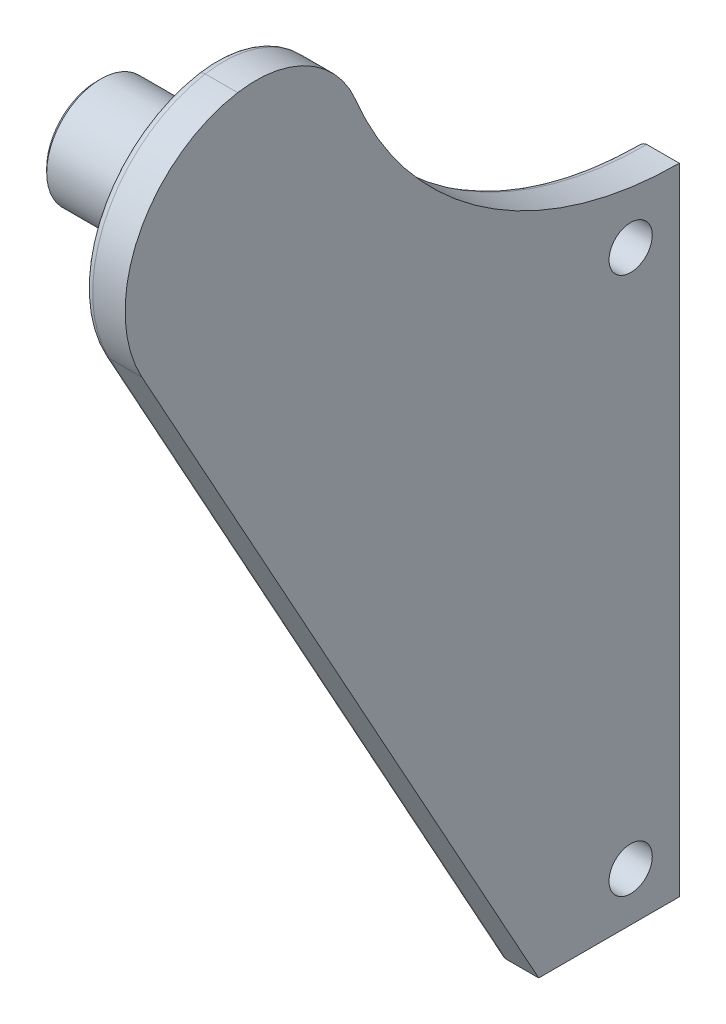
ISO-10303-21;
HEADER;
FILE_DESCRIPTION(('STEP AP214'),'2;1');
FILE_NAME('part.step','',(''),(''),'','','');
FILE_SCHEMA(('AUTOMOTIVE_DESIGN { 1 0 10303 214 1 1 1 1 }'));
ENDSEC;
DATA;
#1=APPLICATION_CONTEXT('core data for automotive mechanical design processes');
#2=APPLICATION_PROTOCOL_DEFINITION('international standard','automotive_design',2000,#1);
#3=PRODUCT_CONTEXT('',#1,'mechanical');
#4=PRODUCT('Part','Part','',(#3));
#5=PRODUCT_RELATED_PRODUCT_CATEGORY('part','',(#4));
#6=PRODUCT_DEFINITION_FORMATION('','',#4);
#7=PRODUCT_DEFINITION_CONTEXT('part definition',#1,'design');
#8=PRODUCT_DEFINITION('design','',#6,#7);
#9=PRODUCT_DEFINITION_SHAPE('','',#8);
#10=(LENGTH_UNIT() NAMED_UNIT(*) SI_UNIT(.MILLI.,.METRE.));
#11=(NAMED_UNIT(*) PLANE_ANGLE_UNIT() SI_UNIT($,.RADIAN.));
#12=(NAMED_UNIT(*) SI_UNIT($,.STERADIAN.) SOLID_ANGLE_UNIT());
#13=UNCERTAINTY_MEASURE_WITH_UNIT(LENGTH_MEASURE(1.E-05),#10,'distance_accuracy_value','');
#14=(GEOMETRIC_REPRESENTATION_CONTEXT(3) GLOBAL_UNCERTAINTY_ASSIGNED_CONTEXT((#13)) GLOBAL_UNIT_ASSIGNED_CONTEXT((#10,
#11,#12)) REPRESENTATION_CONTEXT('',''));
#15=CARTESIAN_POINT('',(0.,0.,0.));
#16=DIRECTION('',(0.,0.,1.));
#17=DIRECTION('',(1.,0.,0.));
#18=AXIS2_PLACEMENT_3D('',#15,#16,#17);
#19=CARTESIAN_POINT('',(3.,0.,0.));
#20=DIRECTION('',(-1.,0.,0.));
#21=DIRECTION('',(0.,0.,1.));
#22=AXIS2_PLACEMENT_3D('',#19,#20,#21);
#23=CYLINDRICAL_SURFACE('',#22,10.);
#24=DIRECTION('',(-1.,0.,0.));
#25=VECTOR('',#24,1.);
#26=CARTESIAN_POINT('',(3.,9.85928106785286,1.67169878419478));
#27=LINE('',#26,#25);
#28=CARTESIAN_POINT('',(3.,9.85928106785286,1.67169878419478));
#29=VERTEX_POINT('',#28);
#30=CARTESIAN_POINT('',(0.6,9.85928106785286,1.67169878419478));
#31=VERTEX_POINT('',#30);
#32=EDGE_CURVE('E181',#29,#31,#27,.T.);
#33=ORIENTED_EDGE('',*,*,#32,.T.);
#34=CARTESIAN_POINT('',(0.6,0.,0.));
#35=DIRECTION('',(1.,0.,0.));
#36=DIRECTION('',(0.,0.,-1.));
#37=AXIS2_PLACEMENT_3D('',#34,#35,#36);
#38=CIRCLE('',#37,10.);
#39=CARTESIAN_POINT('',(0.6,-4.83342796430402,8.75431174415693));
#40=VERTEX_POINT('',#39);
#41=EDGE_CURVE('E205',#31,#40,#38,.T.);
#42=ORIENTED_EDGE('',*,*,#41,.T.);
#43=DIRECTION('',(-1.,0.,0.));
#44=VECTOR('',#43,1.);
#45=CARTESIAN_POINT('',(3.,-4.83342796430402,8.75431174415693));
#46=LINE('',#45,#44);
#47=CARTESIAN_POINT('',(3.,-4.83342796430402,8.75431174415693));
#48=VERTEX_POINT('',#47);
#49=EDGE_CURVE('E158',#48,#40,#46,.T.);
#50=ORIENTED_EDGE('',*,*,#49,.F.);
#51=CARTESIAN_POINT('',(3.,0.,0.));
#52=DIRECTION('',(1.,0.,0.));
#53=DIRECTION('',(0.,0.,-1.));
#54=AXIS2_PLACEMENT_3D('',#51,#52,#53);
#55=CIRCLE('',#54,10.);
#56=EDGE_CURVE('E175',#29,#48,#55,.T.);
#57=ORIENTED_EDGE('',*,*,#56,.F.);
#58=EDGE_LOOP('',(#33,#42,#50,#57));
#59=FACE_BOUND('',#58,.T.);
#60=ADVANCED_FACE('F45',(#59),#23,.T.);
#61=CARTESIAN_POINT('',(3.,-58.,-20.6));
#62=DIRECTION('',(0.,0.483342796430402,-0.875431174415693));
#63=DIRECTION('',(0.,0.875431174415693,0.483342796430402));
#64=AXIS2_PLACEMENT_3D('',#61,#62,#63);
#65=PLANE('',#64);
#66=ORIENTED_EDGE('',*,*,#49,.T.);
#67=DIRECTION('',(0.,-0.875431174415693,-0.483342796430402));
#68=VECTOR('',#67,1.);
#69=CARTESIAN_POINT('',(0.6,-58.,-20.6));
#70=LINE('',#69,#68);
#71=CARTESIAN_POINT('',(0.6,-58.,-20.6));
#72=VERTEX_POINT('',#71);
#73=EDGE_CURVE('E187',#40,#72,#70,.T.);
#74=ORIENTED_EDGE('',*,*,#73,.T.);
#75=DIRECTION('',(-1.,0.,0.));
#76=VECTOR('',#75,1.);
#77=CARTESIAN_POINT('',(3.,-58.,-20.6));
#78=LINE('',#77,#76);
#79=CARTESIAN_POINT('',(3.,-58.,-20.6));
#80=VERTEX_POINT('',#79);
#81=EDGE_CURVE('E152',#80,#72,#78,.T.);
#82=ORIENTED_EDGE('',*,*,#81,.F.);
#83=DIRECTION('',(0.,-0.875431174415693,-0.483342796430402));
#84=VECTOR('',#83,1.);
#85=CARTESIAN_POINT('',(3.,-58.,-20.6));
#86=LINE('',#85,#84);
#87=EDGE_CURVE('E357',#48,#80,#86,.T.);
#88=ORIENTED_EDGE('',*,*,#87,.F.);
#89=EDGE_LOOP('',(#66,#74,#82,#88));
#90=FACE_BOUND('',#89,.T.);
#91=ADVANCED_FACE('F303',(#90),#65,.F.);
#92=CARTESIAN_POINT('',(3.,-58.,-31.));
#93=DIRECTION('',(0.,1.,0.));
#94=DIRECTION('',(0.,0.,1.));
#95=AXIS2_PLACEMENT_3D('',#92,#93,#94);
#96=PLANE('',#95);
#97=ORIENTED_EDGE('',*,*,#81,.T.);
#98=DIRECTION('',(0.,0.,-1.));
#99=VECTOR('',#98,1.);
#100=CARTESIAN_POINT('',(0.6,-58.,-31.));
#101=LINE('',#100,#99);
#102=CARTESIAN_POINT('',(0.6,-58.,-31.));
#103=VERTEX_POINT('',#102);
#104=EDGE_CURVE('E209',#72,#103,#101,.T.);
#105=ORIENTED_EDGE('',*,*,#104,.T.);
#106=DIRECTION('',(-1.,0.,0.));
#107=VECTOR('',#106,1.);
#108=CARTESIAN_POINT('',(3.,-58.,-31.));
#109=LINE('',#108,#107);
#110=CARTESIAN_POINT('',(3.,-58.,-31.));
#111=VERTEX_POINT('',#110);
#112=EDGE_CURVE('E150',#111,#103,#109,.T.);
#113=ORIENTED_EDGE('',*,*,#112,.F.);
#114=DIRECTION('',(0.,0.,-1.));
#115=VECTOR('',#114,1.);
#116=CARTESIAN_POINT('',(3.,-58.,-31.));
#117=LINE('',#116,#115);
#118=EDGE_CURVE('E142',#80,#111,#117,.T.);
#119=ORIENTED_EDGE('',*,*,#118,.F.);
#120=EDGE_LOOP('',(#97,#105,#113,#119));
#121=FACE_BOUND('',#120,.T.);
#122=ADVANCED_FACE('F310',(#121),#96,.F.);
#123=CARTESIAN_POINT('',(3.,-11.,-31.));
#124=DIRECTION('',(0.,0.,1.));
#125=DIRECTION('',(0.,-1.,0.));
#126=AXIS2_PLACEMENT_3D('',#123,#124,#125);
#127=PLANE('',#126);
#128=ORIENTED_EDGE('',*,*,#112,.T.);
#129=DIRECTION('',(0.,1.,0.));
#130=VECTOR('',#129,1.);
#131=CARTESIAN_POINT('',(0.6,-11.,-31.));
#132=LINE('',#131,#130);
#133=CARTESIAN_POINT('',(0.6,-11.,-31.));
#134=VERTEX_POINT('',#133);
#135=EDGE_CURVE('E149',#103,#134,#132,.T.);
#136=ORIENTED_EDGE('',*,*,#135,.T.);
#137=DIRECTION('',(-1.,0.,0.));
#138=VECTOR('',#137,1.);
#139=CARTESIAN_POINT('',(3.,-11.,-31.));
#140=LINE('',#139,#138);
#141=CARTESIAN_POINT('',(3.,-11.,-31.));
#142=VERTEX_POINT('',#141);
#143=EDGE_CURVE('E129',#142,#134,#140,.T.);
#144=ORIENTED_EDGE('',*,*,#143,.F.);
#145=DIRECTION('',(0.,1.,0.));
#146=VECTOR('',#145,1.);
#147=CARTESIAN_POINT('',(3.,-11.,-31.));
#148=LINE('',#147,#146);
#149=EDGE_CURVE('E138',#111,#142,#148,.T.);
#150=ORIENTED_EDGE('',*,*,#149,.F.);
#151=EDGE_LOOP('',(#128,#136,#144,#150));
#152=FACE_BOUND('',#151,.T.);
#153=ADVANCED_FACE('F147',(#152),#127,.F.);
#154=CARTESIAN_POINT('',(3.,0.,0.));
#155=DIRECTION('',(1.,0.,0.));
#156=DIRECTION('',(0.,0.,-1.));
#157=AXIS2_PLACEMENT_3D('',#154,#155,#156);
#158=PLANE('',#157);
#159=CARTESIAN_POINT('',(3.,14.8944628115408,-31.));
#160=DIRECTION('',(1.,0.,0.));
#161=DIRECTION('',(0.,0.,-1.));
#162=AXIS2_PLACEMENT_3D('',#159,#160,#161);
#163=CIRCLE('',#162,25.8944628115408);
#164=CARTESIAN_POINT('',(3.,5.02193708839009,-7.06140271143698));
#165=VERTEX_POINT('',#164);
#166=EDGE_CURVE('E125',#165,#142,#163,.T.);
#167=ORIENTED_EDGE('',*,*,#166,.F.);
#168=CARTESIAN_POINT('',(3.,1.97185621357057,0.334339756838956));
#169=DIRECTION('',(1.,0.,0.));
#170=DIRECTION('',(0.,0.,-1.));
#171=AXIS2_PLACEMENT_3D('',#168,#169,#170);
#172=CIRCLE('',#171,8.);
#173=EDGE_CURVE('E185',#165,#29,#172,.T.);
#174=ORIENTED_EDGE('',*,*,#173,.T.);
#175=ORIENTED_EDGE('',*,*,#56,.T.);
#176=ORIENTED_EDGE('',*,*,#87,.T.);
#177=ORIENTED_EDGE('',*,*,#118,.T.);
#178=ORIENTED_EDGE('',*,*,#149,.T.);
#179=EDGE_LOOP('',(#167,#174,#175,#176,#177,#178));
#180=FACE_BOUND('',#179,.T.);
#181=CARTESIAN_POINT('',(3.,-54.4,-27.4));
#182=DIRECTION('',(1.,0.,0.));
#183=DIRECTION('',(0.,0.,-1.));
#184=AXIS2_PLACEMENT_3D('',#181,#182,#183);
#185=CIRCLE('',#184,1.6);
#186=CARTESIAN_POINT('',(3.,-54.4,-29.));
#187=VERTEX_POINT('',#186);
#188=EDGE_CURVE('E172',#187,#187,#185,.T.);
#189=ORIENTED_EDGE('',*,*,#188,.F.);
#190=EDGE_LOOP('',(#189));
#191=FACE_BOUND('',#190,.T.);
#192=CARTESIAN_POINT('',(3.,-14.6,-27.4));
#193=DIRECTION('',(1.,0.,0.));
#194=DIRECTION('',(0.,0.,-1.));
#195=AXIS2_PLACEMENT_3D('',#192,#193,#194);
#196=CIRCLE('',#195,1.6);
#197=CARTESIAN_POINT('',(3.,-14.6,-29.));
#198=VERTEX_POINT('',#197);
#199=EDGE_CURVE('E178',#198,#198,#196,.T.);
#200=ORIENTED_EDGE('',*,*,#199,.F.);
#201=EDGE_LOOP('',(#200));
#202=FACE_BOUND('',#201,.T.);
#203=ADVANCED_FACE('F139',(#180,#191,#202),#158,.T.);
#204=CARTESIAN_POINT('',(0.,0.,0.));
#205=DIRECTION('',(1.,0.,0.));
#206=DIRECTION('',(0.,0.,-1.));
#207=AXIS2_PLACEMENT_3D('',#204,#205,#206);
#208=PLANE('',#207);
#209=CARTESIAN_POINT('',(0.,1.97185621357057,0.334339756838956));
#210=DIRECTION('',(1.,0.,0.));
#211=DIRECTION('',(0.,0.,-1.));
#212=AXIS2_PLACEMENT_3D('',#209,#210,#211);
#213=CIRCLE('',#212,7.4);
#214=CARTESIAN_POINT('',(0.,9.26772420378169,1.57139685714309));
#215=VERTEX_POINT('',#214);
#216=CARTESIAN_POINT('',(0.,4.79318102277862,-6.50672202631628));
#217=VERTEX_POINT('',#216);
#218=EDGE_CURVE('E201',#215,#217,#213,.F.);
#219=ORIENTED_EDGE('',*,*,#218,.T.);
#220=CARTESIAN_POINT('',(0.,14.8944628115408,-31.));
#221=DIRECTION('',(1.,0.,0.));
#222=DIRECTION('',(0.,0.,-1.));
#223=AXIS2_PLACEMENT_3D('',#220,#221,#222);
#224=CIRCLE('',#223,26.4944628115408);
#225=CARTESIAN_POINT('',(0.,4.43758999069863,-6.65641007409034));
#226=VERTEX_POINT('',#225);
#227=EDGE_CURVE('E203',#217,#226,#224,.T.);
#228=ORIENTED_EDGE('',*,*,#227,.T.);
#229=CARTESIAN_POINT('',(0.,0.,0.));
#230=DIRECTION('',(1.,0.,0.));
#231=DIRECTION('',(0.,0.,-1.));
#232=AXIS2_PLACEMENT_3D('',#229,#230,#231);
#233=CIRCLE('',#232,8.);
#234=CARTESIAN_POINT('',(0.,2.42368159704282,-7.62402567651474));
#235=VERTEX_POINT('',#234);
#236=EDGE_CURVE('E167',#226,#235,#233,.T.);
#237=ORIENTED_EDGE('',*,*,#236,.T.);
#238=CARTESIAN_POINT('',(0.,14.8944628115408,-31.));
#239=DIRECTION('',(1.,0.,0.));
#240=DIRECTION('',(0.,0.,-1.));
#241=AXIS2_PLACEMENT_3D('',#238,#239,#240);
#242=CIRCLE('',#241,26.4944628115408);
#243=CARTESIAN_POINT('',(0.,-11.5932052563001,-30.4));
#244=VERTEX_POINT('',#243);
#245=EDGE_CURVE('E190',#235,#244,#242,.T.);
#246=ORIENTED_EDGE('',*,*,#245,.T.);
#247=DIRECTION('',(0.,1.,0.));
#248=VECTOR('',#247,1.);
#249=CARTESIAN_POINT('',(0.,0.,-30.4));
#250=LINE('',#249,#248);
#251=CARTESIAN_POINT('',(0.,-57.4,-30.4));
#252=VERTEX_POINT('',#251);
#253=EDGE_CURVE('E192',#244,#252,#250,.F.);
#254=ORIENTED_EDGE('',*,*,#253,.T.);
#255=DIRECTION('',(0.,0.,-1.));
#256=VECTOR('',#255,1.);
#257=CARTESIAN_POINT('',(0.,-57.4,0.));
#258=LINE('',#257,#256);
#259=CARTESIAN_POINT('',(0.,-57.4,-20.9541047328463));
#260=VERTEX_POINT('',#259);
#261=EDGE_CURVE('E194',#252,#260,#258,.F.);
#262=ORIENTED_EDGE('',*,*,#261,.T.);
#263=DIRECTION('',(0.,-0.875431174415693,-0.483342796430402));
#264=VECTOR('',#263,1.);
#265=CARTESIAN_POINT('',(0.,-4.54342228644578,8.22905303950752));
#266=LINE('',#265,#264);
#267=CARTESIAN_POINT('',(0.,-4.54342228644578,8.22905303950752));
#268=VERTEX_POINT('',#267);
#269=EDGE_CURVE('E196',#260,#268,#266,.F.);
#270=ORIENTED_EDGE('',*,*,#269,.T.);
#271=CARTESIAN_POINT('',(0.,0.,0.));
#272=DIRECTION('',(1.,0.,0.));
#273=DIRECTION('',(0.,0.,-1.));
#274=AXIS2_PLACEMENT_3D('',#271,#272,#273);
#275=CIRCLE('',#274,9.4);
#276=EDGE_CURVE('E199',#268,#215,#275,.F.);
#277=ORIENTED_EDGE('',*,*,#276,.T.);
#278=EDGE_LOOP('',(#219,#228,#237,#246,#254,#262,#270,#277));
#279=FACE_BOUND('',#278,.T.);
#280=CARTESIAN_POINT('',(0.,-54.4,-27.4));
#281=DIRECTION('',(1.,0.,0.));
#282=DIRECTION('',(0.,0.,-1.));
#283=AXIS2_PLACEMENT_3D('',#280,#281,#282);
#284=CIRCLE('',#283,1.6);
#285=CARTESIAN_POINT('',(0.,-54.4,-29.));
#286=VERTEX_POINT('',#285);
#287=EDGE_CURVE('E171',#286,#286,#284,.T.);
#288=ORIENTED_EDGE('',*,*,#287,.T.);
#289=EDGE_LOOP('',(#288));
#290=FACE_BOUND('',#289,.T.);
#291=CARTESIAN_POINT('',(0.,-14.6,-27.4));
#292=DIRECTION('',(1.,0.,0.));
#293=DIRECTION('',(0.,0.,-1.));
#294=AXIS2_PLACEMENT_3D('',#291,#292,#293);
#295=CIRCLE('',#294,1.6);
#296=CARTESIAN_POINT('',(0.,-14.6,-29.));
#297=VERTEX_POINT('',#296);
#298=EDGE_CURVE('E168',#297,#297,#295,.T.);
#299=ORIENTED_EDGE('',*,*,#298,.T.);
#300=EDGE_LOOP('',(#299));
#301=FACE_BOUND('',#300,.T.);
#302=ADVANCED_FACE('F345',(#279,#290,#301),#208,.F.);
#303=CARTESIAN_POINT('',(-3.,-14.6,-27.4));
#304=DIRECTION('',(1.,0.,0.));
#305=DIRECTION('',(0.,0.,-1.));
#306=AXIS2_PLACEMENT_3D('',#303,#304,#305);
#307=CYLINDRICAL_SURFACE('',#306,1.6);
#308=ORIENTED_EDGE('',*,*,#199,.T.);
#309=EDGE_LOOP('',(#308));
#310=FACE_BOUND('',#309,.T.);
#311=ORIENTED_EDGE('',*,*,#298,.F.);
#312=EDGE_LOOP('',(#311));
#313=FACE_BOUND('',#312,.T.);
#314=ADVANCED_FACE('F341',(#310,#313),#307,.F.);
#315=CARTESIAN_POINT('',(-3.,-54.4,-27.4));
#316=DIRECTION('',(1.,0.,0.));
#317=DIRECTION('',(0.,0.,-1.));
#318=AXIS2_PLACEMENT_3D('',#315,#316,#317);
#319=CYLINDRICAL_SURFACE('',#318,1.6);
#320=ORIENTED_EDGE('',*,*,#188,.T.);
#321=EDGE_LOOP('',(#320));
#322=FACE_BOUND('',#321,.T.);
#323=ORIENTED_EDGE('',*,*,#287,.F.);
#324=EDGE_LOOP('',(#323));
#325=FACE_BOUND('',#324,.T.);
#326=ADVANCED_FACE('F339',(#322,#325),#319,.F.);
#327=CARTESIAN_POINT('',(-1.2,0.,0.));
#328=DIRECTION('',(-1.,0.,0.));
#329=DIRECTION('',(0.,0.,1.));
#330=AXIS2_PLACEMENT_3D('',#327,#328,#329);
#331=PLANE('',#330);
#332=CARTESIAN_POINT('',(-1.2,0.,0.));
#333=DIRECTION('',(-1.,0.,0.));
#334=DIRECTION('',(0.,0.,1.));
#335=AXIS2_PLACEMENT_3D('',#332,#333,#334);
#336=CIRCLE('',#335,6.45080666151703);
#337=CARTESIAN_POINT('',(-1.2,0.,6.45080666151703));
#338=VERTEX_POINT('',#337);
#339=EDGE_CURVE('E53',#338,#338,#336,.T.);
#340=ORIENTED_EDGE('',*,*,#339,.T.);
#341=EDGE_LOOP('',(#340));
#342=FACE_BOUND('',#341,.T.);
#343=CARTESIAN_POINT('',(-1.2,0.,0.));
#344=DIRECTION('',(-1.,0.,0.));
#345=DIRECTION('',(0.,0.,1.));
#346=AXIS2_PLACEMENT_3D('',#343,#344,#345);
#347=CIRCLE('',#346,4.);
#348=CARTESIAN_POINT('',(-1.2,0.,4.));
#349=VERTEX_POINT('',#348);
#350=EDGE_CURVE('E134',#349,#349,#347,.T.);
#351=ORIENTED_EDGE('',*,*,#350,.F.);
#352=EDGE_LOOP('',(#351));
#353=FACE_BOUND('',#352,.T.);
#354=ADVANCED_FACE('F329',(#342,#353),#331,.T.);
#355=CARTESIAN_POINT('',(-9.1,0.,0.));
#356=DIRECTION('',(-1.,0.,0.));
#357=DIRECTION('',(0.,0.,1.));
#358=AXIS2_PLACEMENT_3D('',#355,#356,#357);
#359=PLANE('',#358);
#360=CARTESIAN_POINT('',(-9.1,0.,0.));
#361=DIRECTION('',(-1.,0.,0.));
#362=DIRECTION('',(0.,0.,1.));
#363=AXIS2_PLACEMENT_3D('',#360,#361,#362);
#364=CIRCLE('',#363,3.70000000000001);
#365=CARTESIAN_POINT('',(-9.1,0.,3.70000000000001));
#366=VERTEX_POINT('',#365);
#367=EDGE_CURVE('E161',#366,#366,#364,.T.);
#368=ORIENTED_EDGE('',*,*,#367,.T.);
#369=EDGE_LOOP('',(#368));
#370=FACE_BOUND('',#369,.T.);
#371=ADVANCED_FACE('F320',(#370),#359,.T.);
#372=CARTESIAN_POINT('',(-9.1,0.,0.));
#373=DIRECTION('',(1.,0.,0.));
#374=DIRECTION('',(0.,0.,-1.));
#375=AXIS2_PLACEMENT_3D('',#372,#373,#374);
#376=CONICAL_SURFACE('',#375,3.70000000000001,0.785398163397445);
#377=CARTESIAN_POINT('',(-8.80000000000001,0.,0.));
#378=DIRECTION('',(-1.,0.,0.));
#379=DIRECTION('',(0.,0.,1.));
#380=AXIS2_PLACEMENT_3D('',#377,#378,#379);
#381=CIRCLE('',#380,4.);
#382=CARTESIAN_POINT('',(-8.80000000000001,0.,4.));
#383=VERTEX_POINT('',#382);
#384=EDGE_CURVE('E164',#383,#383,#381,.F.);
#385=ORIENTED_EDGE('',*,*,#384,.F.);
#386=EDGE_LOOP('',(#385));
#387=FACE_BOUND('',#386,.T.);
#388=ORIENTED_EDGE('',*,*,#367,.F.);
#389=EDGE_LOOP('',(#388));
#390=FACE_BOUND('',#389,.T.);
#391=ADVANCED_FACE('F315',(#387,#390),#376,.T.);
#392=CARTESIAN_POINT('',(-9.1,0.,0.));
#393=DIRECTION('',(1.,0.,0.));
#394=DIRECTION('',(0.,0.,-1.));
#395=AXIS2_PLACEMENT_3D('',#392,#393,#394);
#396=CYLINDRICAL_SURFACE('',#395,4.);
#397=ORIENTED_EDGE('',*,*,#350,.T.);
#398=EDGE_LOOP('',(#397));
#399=FACE_BOUND('',#398,.T.);
#400=ORIENTED_EDGE('',*,*,#384,.T.);
#401=EDGE_LOOP('',(#400));
#402=FACE_BOUND('',#401,.T.);
#403=ADVANCED_FACE('F319',(#399,#402),#396,.T.);
#404=CARTESIAN_POINT('',(-1.,0.,0.));
#405=DIRECTION('',(1.,0.,0.));
#406=DIRECTION('',(0.,0.,-1.));
#407=AXIS2_PLACEMENT_3D('',#404,#405,#406);
#408=TOROIDAL_SURFACE('',#407,8.,1.);
#409=CARTESIAN_POINT('',(-0.75,0.,0.));
#410=DIRECTION('',(-1.,0.,0.));
#411=DIRECTION('',(0.,0.,1.));
#412=AXIS2_PLACEMENT_3D('',#409,#410,#411);
#413=CIRCLE('',#412,7.03175416344815);
#414=CARTESIAN_POINT('',(-0.75,0.,7.03175416344815));
#415=VERTEX_POINT('',#414);
#416=EDGE_CURVE('E11',#415,#415,#413,.F.);
#417=ORIENTED_EDGE('',*,*,#416,.T.);
#418=EDGE_LOOP('',(#417));
#419=FACE_BOUND('',#418,.T.);
#420=ORIENTED_EDGE('',*,*,#236,.F.);
#421=CARTESIAN_POINT('',(-0.0478804433833943,1.0003606021549,-8.24526300629557));
#422=CARTESIAN_POINT('',(-0.267684264583023,1.42688139065347,-8.88306795042223));
#423=CARTESIAN_POINT('',(0.523391290586569,1.3366028603173,-8.93854860075433));
#424=CARTESIAN_POINT('',(-0.0367264380292883,1.11430973360945,-8.1962853317056));
#425=CARTESIAN_POINT('',(-0.227692457088528,1.51896169663643,-8.82705552516744));
#426=CARTESIAN_POINT('',(0.541237700747614,1.44807301322936,-8.8700394735209));
#427=CARTESIAN_POINT('',(-0.0282518373021132,1.22988845216687,-8.14662971538212));
#428=CARTESIAN_POINT('',(-0.192784859939197,1.61784472457236,-8.76772107401659));
#429=CARTESIAN_POINT('',(0.554797062055896,1.560439692514,-8.80215337957023));
#430=CARTESIAN_POINT('',(-0.0152950802306381,1.46348804527264,-8.04597876405275));
#431=CARTESIAN_POINT('',(-0.133248417325821,1.82193983250548,-8.64721123999878));
#432=CARTESIAN_POINT('',(0.575527872717952,1.78648738008317,-8.66792937340522));
#433=CARTESIAN_POINT('',(-0.0108081482810371,1.58150582493962,-7.9949851070658));
#434=CARTESIAN_POINT('',(-0.108130915349578,1.92743779241566,-8.58580368144299));
#435=CARTESIAN_POINT('',(0.582706963041337,1.90016665061082,-8.60158970221847));
#436=CARTESIAN_POINT('',(-0.00444037757916053,1.81943655170222,-7.89155981243874));
#437=CARTESIAN_POINT('',(-0.0660613803825074,2.14277216057695,-8.46263221193481));
#438=CARTESIAN_POINT('',(0.592895395582376,2.12862353919694,-8.47059887045268));
#439=CARTESIAN_POINT('',(-0.00255939608916118,1.93934939463418,-7.83912825371835));
#440=CARTESIAN_POINT('',(-0.0487891020920756,2.25303924673469,-8.40056628032424));
#441=CARTESIAN_POINT('',(0.595904966180334,2.24340109675133,-8.40594761758293));
#442=CARTESIAN_POINT('',(-0.000340421737815697,2.1805916229403,-7.73273177222031));
#443=CARTESIAN_POINT('',(-0.0204003616713467,2.47659850434508,-8.27697576205483));
#444=CARTESIAN_POINT('',(0.599455325298626,2.4739939679895,-8.27836886496583));
#445=CARTESIAN_POINT('',(-2.98264968631588E-06,2.30192150105227,-7.67876630611185));
#446=CARTESIAN_POINT('',(-0.00908762293609337,2.59040539539139,-8.21512230911322));
#447=CARTESIAN_POINT('',(0.599995227781715,2.58980963918633,-8.21544199191724));
#448=CARTESIAN_POINT('',(4.1196350311495E-06,2.59185661240204,-7.54841793205318));
#449=CARTESIAN_POINT('',(0.0123295965563933,2.863063292895,-8.06966706387504));
#450=CARTESIAN_POINT('',(0.60000659138675,2.8667152622012,-8.06771626769825));
#451=CARTESIAN_POINT('',(-0.000629807550909609,2.7608523599051,-7.47133139830006));
#452=CARTESIAN_POINT('',(0.0206689875249352,3.02491082873027,-7.98542824483889));
#453=CARTESIAN_POINT('',(0.598992307929969,3.02823420653035,-7.98372393259401));
#454=CARTESIAN_POINT('',(-0.00164787528846968,3.09908070141187,-7.31436286855086));
#455=CARTESIAN_POINT('',(0.0313640663373621,3.35017689585927,-7.82057820410551));
#456=CARTESIAN_POINT('',(0.597363399564517,3.35298354685944,-7.81917627227308));
#457=CARTESIAN_POINT('',(-0.00203205499025126,3.268313254124,-7.23448131276954));
#458=CARTESIAN_POINT('',(0.0338356285346082,3.51522341054377,-7.73909619700471));
#459=CARTESIAN_POINT('',(0.596748712015598,3.51621367053825,-7.73862041020918));
#460=CARTESIAN_POINT('',(-0.00203205499025133,3.60566270919183,-7.07239618654368));
#461=CARTESIAN_POINT('',(0.0338356285346088,3.84532649979196,-7.58049270710852));
#462=CARTESIAN_POINT('',(0.596748712015598,3.84433623979748,-7.58096849390405));
#463=CARTESIAN_POINT('',(-0.00164787528846983,3.77377961154754,-6.99019261609915));
#464=CARTESIAN_POINT('',(0.0313640663373633,4.01207704955811,-7.50255732590484));
#465=CARTESIAN_POINT('',(0.597363399564517,4.0092286853779,-7.50387243966284));
#466=CARTESIAN_POINT('',(-0.000629807550909884,4.10768371079521,-6.82422399606619));
#467=CARTESIAN_POINT('',(0.0206689875249353,4.34403423648556,-7.35163358223746));
#468=CARTESIAN_POINT('',(0.598992307929969,4.34062690102023,-7.35316315252248));
#469=CARTESIAN_POINT('',(4.11963503083646E-06,4.27347053820501,-6.74045870362604));
#470=CARTESIAN_POINT('',(0.0123295965563916,4.5109380229765,-7.27791839015644));
#471=CARTESIAN_POINT('',(0.60000659138675,4.50713292003075,-7.27955046770027));
#472=CARTESIAN_POINT('',(-2.98264968646306E-06,4.55641382577815,-6.5955581741914));
#473=CARTESIAN_POINT('',(-0.00908762293609492,4.79487890760235,-7.15594654309216));
#474=CARTESIAN_POINT('',(0.599995227781715,4.79550077215422,-7.15568119986126));
#475=CARTESIAN_POINT('',(-0.000340421737815703,4.67436364306198,-6.53455775240859));
#476=CARTESIAN_POINT('',(-0.0204003616713472,4.91428585652843,-7.10574854872392));
#477=CARTESIAN_POINT('',(0.599455325298626,4.91700102729005,-7.10458571035022));
#478=CARTESIAN_POINT('',(-0.00255939608916118,4.90817951216759,-6.41270471244791));
#479=CARTESIAN_POINT('',(-0.0487891020920754,5.15047523399551,-7.00844522996694));
#480=CARTESIAN_POINT('',(0.595904966180335,5.16069932778723,-7.00428342363654));
#481=CARTESIAN_POINT('',(-0.00444037757916068,5.02404629608194,-6.35185204911083));
#482=CARTESIAN_POINT('',(-0.0660613803825078,5.26783605726032,-6.96114356700451));
#483=CARTESIAN_POINT('',(0.592895395582376,5.28289710728818,-6.9550759556991));
#484=CARTESIAN_POINT('',(-0.0108081482810374,5.25347319185914,-6.23072764281502));
#485=CARTESIAN_POINT('',(-0.108130915349579,5.49855858045888,-6.86999962424847));
#486=CARTESIAN_POINT('',(0.582706963041336,5.5279244788744,-6.85857344214273));
#487=CARTESIAN_POINT('',(-0.0152950802306384,5.36703317701726,-6.17045593186109));
#488=CARTESIAN_POINT('',(-0.133248417325822,5.61242519921606,-6.82600984218716));
#489=CARTESIAN_POINT('',(0.575527872717952,5.650754105203,-6.81127850143193));
#490=CARTESIAN_POINT('',(-0.0282518373021133,5.59158761293529,-6.05097920102102));
#491=CARTESIAN_POINT('',(-0.192784859939199,5.83404639464231,-6.74197723592584));
#492=CARTESIAN_POINT('',(0.554797062055896,5.89680014246086,-6.7186772679841));
#493=CARTESIAN_POINT('',(-0.0367264380292883,5.70257881967359,-5.99177554874673));
#494=CARTESIAN_POINT('',(-0.227692457088529,5.94216087793204,-6.70185630859179));
#495=CARTESIAN_POINT('',(0.541237700747614,6.02001684071701,-6.67337343110256));
#496=CARTESIAN_POINT('',(-0.047880443383394,5.81202242954513,-5.93342048533511));
#497=CARTESIAN_POINT('',(-0.267684264583023,6.04343083578416,-6.66497040112744));
#498=CARTESIAN_POINT('',(0.523391290586569,6.14315971047205,-6.62915885055475));
#499=(BOUNDED_SURFACE() B_SPLINE_SURFACE(3,2,((#421,#422,#423),(#424,#425,#426),(#427,#428,
#429),(#430,#431,#432),(#433,#434,#435),(#436,#437,#438),(#439,#440,#441),(#442,#443,#444),
(#445,#446,#447),(#448,#449,#450),(#451,#452,#453),(#454,#455,#456),(#457,#458,#459),(#460,#461,
#462),(#463,#464,#465),(#466,#467,#468),(#469,#470,#471),(#472,#473,#474),(#475,#476,#477),
(#478,#479,#480),(#481,#482,#483),(#484,#485,#486),(#487,#488,#489),(#490,#491,#492),(#493,#494,
#495),(#496,#497,#498)),.UNSPECIFIED.,.F.,.F.,.F.) B_SPLINE_SURFACE_WITH_KNOTS((4,2,2,2,2,2,2,2,
2,2,2,2,4),(3,3),(0.,0.404921875785336,0.809358163838425,1.21377229851648,1.61833151256523,
2.17710860191349,2.73579807679646,3.29448755167943,3.85326464102769,4.25782385507644,
4.66223798975449,5.06667427780758,5.47159615359292),(0.,1.),
.UNSPECIFIED.) GEOMETRIC_REPRESENTATION_ITEM() RATIONAL_B_SPLINE_SURFACE(((1.,0.600893336294649,
1.),(1.,0.613061713141837,1.),(1.,0.624466773143234,1.),(1.,0.645637111245051,1.),(1.,
0.655404339392109,1.),(1.,0.673215041779364,1.),(1.,0.681258610410484,1.),(1.,0.695548788615775,
1.),(1.,0.701794752514385,1.),(1.,0.714443753913629,1.),(1.,0.719999046476312,1.),(1.,
0.727420195462791,1.),(1.,0.729286630241827,1.),(1.,0.729286630241828,1.),(1.,0.727420195462792,
1.),(1.,0.719999046476312,1.),(1.,0.714443753913629,1.),(1.,0.701794752514385,1.),(1.,
0.695548788615774,1.),(1.,0.681258610410484,1.),(1.,0.673215041779364,1.),(1.,0.655404339392108,
1.),(1.,0.64563711124505,1.),(1.,0.624466773143233,1.),(1.,0.613061713141837,1.),(1.,
0.600893336294649,1.))) REPRESENTATION_ITEM('') SURFACE());
#500=CARTESIAN_POINT('',(-0.047880443383394,5.81202242954513,-5.93342048533511));
#501=CARTESIAN_POINT('',(-0.0367264380292883,5.70257881967359,-5.99177554874673));
#502=CARTESIAN_POINT('',(-0.0282518373021133,5.59158761293529,-6.05097920102102));
#503=CARTESIAN_POINT('',(-0.0152950802306384,5.36703317701726,-6.17045593186109));
#504=CARTESIAN_POINT('',(-0.0108081482810374,5.25347319185914,-6.23072764281502));
#505=CARTESIAN_POINT('',(-0.00444037757916068,5.02404629608194,-6.35185204911083));
#506=CARTESIAN_POINT('',(-0.00255939608916118,4.90817951216759,-6.41270471244791));
#507=CARTESIAN_POINT('',(-0.000340421737815699,4.67436364306198,-6.53455775240859));
#508=CARTESIAN_POINT('',(-2.9826496864617E-06,4.55641382577815,-6.5955581741914));
#509=CARTESIAN_POINT('',(4.11963503083458E-06,4.27347053820501,-6.74045870362604));
#510=CARTESIAN_POINT('',(-0.000629807550909885,4.10768371079521,-6.82422399606619));
#511=CARTESIAN_POINT('',(-0.00164787528846983,3.77377961154754,-6.99019261609915));
#512=CARTESIAN_POINT('',(-0.00203205499025133,3.60566270919183,-7.07239618654368));
#513=CARTESIAN_POINT('',(-0.00203205499025126,3.268313254124,-7.23448131276954));
#514=CARTESIAN_POINT('',(-0.00164787528846968,3.09908070141187,-7.31436286855086));
#515=CARTESIAN_POINT('',(-0.000629807550909609,2.7608523599051,-7.47133139830006));
#516=CARTESIAN_POINT('',(4.1196350311491E-06,2.59185661240204,-7.54841793205318));
#517=CARTESIAN_POINT('',(-2.98264968631559E-06,2.30192150105227,-7.67876630611185));
#518=CARTESIAN_POINT('',(-0.000340421737815697,2.1805916229403,-7.73273177222031));
#519=CARTESIAN_POINT('',(-0.00255939608916118,1.93934939463418,-7.83912825371835));
#520=CARTESIAN_POINT('',(-0.00444037757916053,1.81943655170222,-7.89155981243874));
#521=CARTESIAN_POINT('',(-0.0108081482810371,1.58150582493962,-7.9949851070658));
#522=CARTESIAN_POINT('',(-0.0152950802306381,1.46348804527264,-8.04597876405275));
#523=CARTESIAN_POINT('',(-0.0282518373021132,1.22988845216687,-8.14662971538212));
#524=CARTESIAN_POINT('',(-0.0367264380292883,1.11430973360945,-8.1962853317056));
#525=CARTESIAN_POINT('',(-0.0478804433833943,1.0003606021549,-8.24526300629557));
#526=B_SPLINE_CURVE_WITH_KNOTS('',3,(#500,#501,#502,#503,#504,#505,#506,#507,#508,#509,#510,
#511,#512,#513,#514,#515,#516,#517,#518,#519,#520,#521,#522,#523,#524,#525),.UNSPECIFIED.,.F.,
.F.,(4,2,2,2,2,2,2,2,2,2,2,2,4),(0.,0.404921875785337,0.809358163838426,1.21377229851648,
1.61833151256523,2.17710860191349,2.73579807679646,3.29448755167943,3.85326464102769,
4.25782385507644,4.6622379897545,5.06667427780758,5.47159615359292),.UNSPECIFIED.);
#527=EDGE_CURVE('E255',#226,#235,#526,.T.);
#528=ORIENTED_EDGE('',*,*,#527,.T.);
#529=EDGE_LOOP('',(#420,#528));
#530=FACE_BOUND('',#529,.T.);
#531=ADVANCED_FACE('F243',(#419,#530),#408,.F.);
#532=CARTESIAN_POINT('',(10.,14.8944628115408,-31.));
#533=DIRECTION('',(-1.,0.,0.));
#534=DIRECTION('',(0.,0.,1.));
#535=AXIS2_PLACEMENT_3D('',#532,#533,#534);
#536=CYLINDRICAL_SURFACE('',#535,25.8944628115408);
#537=ORIENTED_EDGE('',*,*,#143,.T.);
#538=CARTESIAN_POINT('',(0.6,14.8944628115408,-31.));
#539=DIRECTION('',(1.,0.,0.));
#540=DIRECTION('',(0.,0.,-1.));
#541=AXIS2_PLACEMENT_3D('',#538,#539,#540);
#542=CIRCLE('',#541,25.8944628115408);
#543=CARTESIAN_POINT('',(0.6,2.70609791859358,-8.15340363348097));
#544=VERTEX_POINT('',#543);
#545=EDGE_CURVE('E60',#134,#544,#542,.F.);
#546=ORIENTED_EDGE('',*,*,#545,.T.);
#547=CARTESIAN_POINT('',(0.523391290586569,1.3366028603173,-8.93854860075433));
#548=CARTESIAN_POINT('',(0.541237700747614,1.44807301322936,-8.8700394735209));
#549=CARTESIAN_POINT('',(0.554797062055896,1.560439692514,-8.80215337957023));
#550=CARTESIAN_POINT('',(0.575527872717952,1.78648738008317,-8.66792937340522));
#551=CARTESIAN_POINT('',(0.582706963041337,1.90016665061082,-8.60158970221847));
#552=CARTESIAN_POINT('',(0.592895395582376,2.12862353919694,-8.47059887045268));
#553=CARTESIAN_POINT('',(0.595904966180334,2.24340109675133,-8.40594761758293));
#554=CARTESIAN_POINT('',(0.599455325298626,2.4739939679895,-8.27836886496583));
#555=CARTESIAN_POINT('',(0.599995227781715,2.58980963918633,-8.21544199191724));
#556=CARTESIAN_POINT('',(0.60000659138675,2.8667152622012,-8.06771626769825));
#557=CARTESIAN_POINT('',(0.598992307929968,3.02823420653034,-7.98372393259401));
#558=CARTESIAN_POINT('',(0.597363399564517,3.35298354685944,-7.81917627227308));
#559=CARTESIAN_POINT('',(0.596748712015598,3.51621367053825,-7.73862041020918));
#560=CARTESIAN_POINT('',(0.596748712015598,3.84433623979748,-7.58096849390405));
#561=CARTESIAN_POINT('',(0.597363399564517,4.0092286853779,-7.50387243966284));
#562=CARTESIAN_POINT('',(0.598992307929969,4.34062690102023,-7.35316315252248));
#563=CARTESIAN_POINT('',(0.60000659138675,4.50713292003075,-7.27955046770027));
#564=CARTESIAN_POINT('',(0.599995227781714,4.79550077215422,-7.15568119986126));
#565=CARTESIAN_POINT('',(0.599455325298626,4.91700102729005,-7.10458571035022));
#566=CARTESIAN_POINT('',(0.595904966180335,5.16069932778723,-7.00428342363654));
#567=CARTESIAN_POINT('',(0.592895395582376,5.28289710728818,-6.9550759556991));
#568=CARTESIAN_POINT('',(0.582706963041336,5.5279244788744,-6.85857344214273));
#569=CARTESIAN_POINT('',(0.575527872717952,5.650754105203,-6.81127850143193));
#570=CARTESIAN_POINT('',(0.554797062055896,5.89680014246086,-6.7186772679841));
#571=CARTESIAN_POINT('',(0.541237700747614,6.02001684071701,-6.67337343110256));
#572=CARTESIAN_POINT('',(0.523391290586569,6.14315971047205,-6.62915885055475));
#573=B_SPLINE_CURVE_WITH_KNOTS('',3,(#547,#548,#549,#550,#551,#552,#553,#554,#555,#556,#557,
#558,#559,#560,#561,#562,#563,#564,#565,#566,#567,#568,#569,#570,#571,#572),.UNSPECIFIED.,.F.,
.F.,(4,2,2,2,2,2,2,2,2,2,2,2,4),(0.,0.404921875785336,0.809358163838425,1.21377229851648,
1.61833151256523,2.17710860191349,2.73579807679646,3.29448755167943,3.85326464102769,
4.25782385507644,4.66223798975449,5.06667427780758,5.47159615359292),.UNSPECIFIED.);
#574=CARTESIAN_POINT('',(0.6,4.67439885665429,-7.2077008875498));
#575=VERTEX_POINT('',#574);
#576=EDGE_CURVE('E64',#544,#575,#573,.T.);
#577=ORIENTED_EDGE('',*,*,#576,.T.);
#578=CARTESIAN_POINT('',(0.6,14.8944628115408,-31.));
#579=DIRECTION('',(1.,0.,0.));
#580=DIRECTION('',(0.,0.,-1.));
#581=AXIS2_PLACEMENT_3D('',#578,#579,#580);
#582=CIRCLE('',#581,25.8944628115408);
#583=CARTESIAN_POINT('',(0.6,5.02193708839009,-7.06140271143698));
#584=VERTEX_POINT('',#583);
#585=EDGE_CURVE('E212',#575,#584,#582,.F.);
#586=ORIENTED_EDGE('',*,*,#585,.T.);
#587=DIRECTION('',(-1.,0.,0.));
#588=VECTOR('',#587,1.);
#589=CARTESIAN_POINT('',(10.,5.02193708839009,-7.06140271143698));
#590=LINE('',#589,#588);
#591=EDGE_CURVE('E131',#584,#165,#590,.F.);
#592=ORIENTED_EDGE('',*,*,#591,.T.);
#593=ORIENTED_EDGE('',*,*,#166,.T.);
#594=EDGE_LOOP('',(#537,#546,#577,#586,#592,#593));
#595=FACE_BOUND('',#594,.T.);
#596=ADVANCED_FACE('F127',(#595),#536,.F.);
#597=CARTESIAN_POINT('',(10.,1.97185621357057,0.334339756838956));
#598=DIRECTION('',(1.,0.,0.));
#599=DIRECTION('',(0.,0.,-1.));
#600=AXIS2_PLACEMENT_3D('',#597,#598,#599);
#601=CYLINDRICAL_SURFACE('',#600,8.);
#602=ORIENTED_EDGE('',*,*,#591,.F.);
#603=CARTESIAN_POINT('',(0.6,1.97185621357057,0.334339756838956));
#604=DIRECTION('',(1.,0.,0.));
#605=DIRECTION('',(0.,0.,-1.));
#606=AXIS2_PLACEMENT_3D('',#603,#604,#605);
#607=CIRCLE('',#606,8.);
#608=EDGE_CURVE('E207',#584,#31,#607,.T.);
#609=ORIENTED_EDGE('',*,*,#608,.T.);
#610=ORIENTED_EDGE('',*,*,#32,.F.);
#611=ORIENTED_EDGE('',*,*,#173,.F.);
#612=EDGE_LOOP('',(#602,#609,#610,#611));
#613=FACE_BOUND('',#612,.T.);
#614=ADVANCED_FACE('F228',(#613),#601,.T.);
#615=CARTESIAN_POINT('',(0.6,2.42368159704282,-7.62402567651474));
#616=DIRECTION('',(0.,-0.882296594943713,-0.470693869251268));
#617=DIRECTION('',(0.,0.470693869251268,-0.882296594943713));
#618=AXIS2_PLACEMENT_3D('',#615,#616,#617);
#619=CIRCLE('',#618,0.6);
#620=EDGE_CURVE('E375',#235,#544,#619,.T.);
#621=ORIENTED_EDGE('',*,*,#620,.F.);
#622=ORIENTED_EDGE('',*,*,#527,.F.);
#623=CARTESIAN_POINT('',(0.6,4.43758999069863,-6.65641007409034));
#624=DIRECTION('',(0.,0.918818022432437,0.394681443259428));
#625=DIRECTION('',(0.,-0.394681443259428,0.918818022432437));
#626=AXIS2_PLACEMENT_3D('',#623,#624,#625);
#627=CIRCLE('',#626,0.6);
#628=EDGE_CURVE('E135',#575,#226,#627,.T.);
#629=ORIENTED_EDGE('',*,*,#628,.F.);
#630=ORIENTED_EDGE('',*,*,#576,.F.);
#631=EDGE_LOOP('',(#621,#622,#629,#630));
#632=FACE_BOUND('',#631,.T.);
#633=ADVANCED_FACE('F232',(#632),#499,.T.);
#634=CARTESIAN_POINT('',(0.6,14.8944628115408,-31.));
#635=DIRECTION('',(1.,0.,0.));
#636=DIRECTION('',(0.,0.,-1.));
#637=AXIS2_PLACEMENT_3D('',#634,#635,#636);
#638=TOROIDAL_SURFACE('',#637,26.4944628115408,0.6);
#639=ORIENTED_EDGE('',*,*,#628,.T.);
#640=ORIENTED_EDGE('',*,*,#227,.F.);
#641=CARTESIAN_POINT('',(0.6,4.79318102277862,-6.50672202631628));
#642=DIRECTION('',(0.,0.924467808534492,0.381260109352439));
#643=DIRECTION('',(0.,-0.381260109352439,0.924467808534492));
#644=AXIS2_PLACEMENT_3D('',#641,#642,#643);
#645=CIRCLE('',#644,0.6);
#646=EDGE_CURVE('E285',#584,#217,#645,.T.);
#647=ORIENTED_EDGE('',*,*,#646,.F.);
#648=ORIENTED_EDGE('',*,*,#585,.F.);
#649=EDGE_LOOP('',(#639,#640,#647,#648));
#650=FACE_BOUND('',#649,.T.);
#651=ADVANCED_FACE('F238',(#650),#638,.T.);
#652=CARTESIAN_POINT('',(0.6,14.8944628115408,-31.));
#653=DIRECTION('',(1.,0.,0.));
#654=DIRECTION('',(0.,0.,-1.));
#655=AXIS2_PLACEMENT_3D('',#652,#653,#654);
#656=TOROIDAL_SURFACE('',#655,26.4944628115408,0.6);
#657=ORIENTED_EDGE('',*,*,#620,.T.);
#658=ORIENTED_EDGE('',*,*,#545,.F.);
#659=CARTESIAN_POINT('',(0.6,-11.,-31.));
#660=CARTESIAN_POINT('',(0.586527132764869,-10.999998133003,-31.0000018269515));
#661=CARTESIAN_POINT('',(0.573062612905632,-11.0004541960263,-30.9995458071142));
#662=CARTESIAN_POINT('',(0.546264537898522,-11.0022605153472,-30.9977394103698));
#663=CARTESIAN_POINT('',(0.532930887508203,-11.0036100634498,-30.9963897417872));
#664=CARTESIAN_POINT('',(0.493515522857043,-11.0089337961588,-30.991064914975));
#665=CARTESIAN_POINT('',(0.467760747999423,-11.01418399497,-30.985813021506));
#666=CARTESIAN_POINT('',(0.417997726881278,-11.0276746328275,-30.9723114345457));
#667=CARTESIAN_POINT('',(0.393984823845292,-11.0359067175468,-30.964070116413));
#668=CARTESIAN_POINT('',(0.347983175830777,-11.0548668986014,-30.9450767154006));
#669=CARTESIAN_POINT('',(0.325999196689213,-11.0656006729193,-30.9343189207704));
#670=CARTESIAN_POINT('',(0.275734635189428,-11.0938779290938,-30.9059571389225));
#671=CARTESIAN_POINT('',(0.248573408805364,-11.1124081154819,-30.8873555183205));
#672=CARTESIAN_POINT('',(0.198808415081671,-11.1522680771206,-30.8472919526884));
#673=CARTESIAN_POINT('',(0.176213534325519,-11.1736031804192,-30.8258245627927));
#674=CARTESIAN_POINT('',(0.127619465516147,-11.2267158264205,-30.7723099023562));
#675=CARTESIAN_POINT('',(0.103599493392706,-11.2593764444884,-30.7393464038564));
#676=CARTESIAN_POINT('',(0.0632576873050127,-11.326882543851,-30.6710763350451));
#677=CARTESIAN_POINT('',(0.0469444482279786,-11.3617304156504,-30.6357671985769));
#678=CARTESIAN_POINT('',(0.02293139608712,-11.4287067961471,-30.5677636398195));
#679=CARTESIAN_POINT('',(0.0144828300582498,-11.4607140851292,-30.5352074752948));
#680=CARTESIAN_POINT('',(0.00312442361938684,-11.5250928043997,-30.4696031735631));
#681=CARTESIAN_POINT('',(0.000203118269826285,-11.5574633405196,-30.436556198338));
#682=CARTESIAN_POINT('',(3.41339309246895E-06,-11.590921857428,-30.4023356332304));
#683=CARTESIAN_POINT('',(4.23093518559285E-09,-11.5920635963803,-30.4011678141981));
#684=CARTESIAN_POINT('',(0.,-11.5932052563001,-30.4));
#685=B_SPLINE_CURVE_WITH_KNOTS('',3,(#659,#660,#661,#662,#663,#664,#665,#666,#667,#668,#669,
#670,#671,#672,#673,#674,#675,#676,#677,#678,#679,#680,#681,#682,#683,#684),.UNSPECIFIED.,.F.,
.F.,(4,2,2,2,2,2,2,2,2,2,2,2,4),(0.,0.0403874001361216,0.0807428266371725,0.160689949943909,
0.240414796853804,0.320322385088018,0.433029221636433,0.545953328902873,0.701871762909486,
0.857963675886966,0.996926875726941,1.13560151331167,1.14050113179101),.UNSPECIFIED.);
#686=EDGE_CURVE('E276',#244,#134,#685,.F.);
#687=ORIENTED_EDGE('',*,*,#686,.F.);
#688=ORIENTED_EDGE('',*,*,#245,.F.);
#689=EDGE_LOOP('',(#657,#658,#687,#688));
#690=FACE_BOUND('',#689,.T.);
#691=ADVANCED_FACE('F286',(#690),#656,.T.);
#692=CARTESIAN_POINT('',(0.6,1.97185621357057,0.334339756838956));
#693=DIRECTION('',(1.,0.,0.));
#694=DIRECTION('',(0.,0.,-1.));
#695=AXIS2_PLACEMENT_3D('',#692,#693,#694);
#696=TOROIDAL_SURFACE('',#695,7.4,0.6);
#697=ORIENTED_EDGE('',*,*,#646,.T.);
#698=ORIENTED_EDGE('',*,*,#218,.F.);
#699=CARTESIAN_POINT('',(0.6,9.26772420378169,1.57139685714309));
#700=DIRECTION('',(0.,-0.167169878419478,0.985928106785285));
#701=DIRECTION('',(0.,-0.985928106785286,-0.167169878419478));
#702=AXIS2_PLACEMENT_3D('',#699,#700,#701);
#703=CIRCLE('',#702,0.6);
#704=EDGE_CURVE('E273',#31,#215,#703,.T.);
#705=ORIENTED_EDGE('',*,*,#704,.F.);
#706=ORIENTED_EDGE('',*,*,#608,.F.);
#707=EDGE_LOOP('',(#697,#698,#705,#706));
#708=FACE_BOUND('',#707,.T.);
#709=ADVANCED_FACE('F293',(#708),#696,.T.);
#710=CARTESIAN_POINT('',(0.6,-11.,-30.4));
#711=DIRECTION('',(0.,1.,0.));
#712=DIRECTION('',(0.,0.,1.));
#713=AXIS2_PLACEMENT_3D('',#710,#711,#712);
#714=CYLINDRICAL_SURFACE('',#713,0.6);
#715=ORIENTED_EDGE('',*,*,#686,.T.);
#716=ORIENTED_EDGE('',*,*,#135,.F.);
#717=CARTESIAN_POINT('',(0.6,-57.4,-30.4));
#718=DIRECTION('',(0.,0.707106781186548,-0.707106781186547));
#719=DIRECTION('',(0.,0.707106781186547,0.707106781186548));
#720=AXIS2_PLACEMENT_3D('',#717,#718,#719);
#721=ELLIPSE('',#720,0.848528137423857,0.6);
#722=EDGE_CURVE('E270',#252,#103,#721,.F.);
#723=ORIENTED_EDGE('',*,*,#722,.F.);
#724=ORIENTED_EDGE('',*,*,#253,.F.);
#725=EDGE_LOOP('',(#715,#716,#723,#724));
#726=FACE_BOUND('',#725,.T.);
#727=ADVANCED_FACE('F289',(#726),#714,.T.);
#728=CARTESIAN_POINT('',(0.6,0.,0.));
#729=DIRECTION('',(1.,0.,0.));
#730=DIRECTION('',(0.,0.,-1.));
#731=AXIS2_PLACEMENT_3D('',#728,#729,#730);
#732=TOROIDAL_SURFACE('',#731,9.4,0.6);
#733=ORIENTED_EDGE('',*,*,#704,.T.);
#734=ORIENTED_EDGE('',*,*,#276,.F.);
#735=CARTESIAN_POINT('',(0.6,-4.54342228644578,8.22905303950752));
#736=DIRECTION('',(0.,-0.875431174415693,-0.483342796430402));
#737=DIRECTION('',(0.,0.483342796430402,-0.875431174415693));
#738=AXIS2_PLACEMENT_3D('',#735,#736,#737);
#739=CIRCLE('',#738,0.6);
#740=EDGE_CURVE('E268',#40,#268,#739,.T.);
#741=ORIENTED_EDGE('',*,*,#740,.F.);
#742=ORIENTED_EDGE('',*,*,#41,.F.);
#743=EDGE_LOOP('',(#733,#734,#741,#742));
#744=FACE_BOUND('',#743,.T.);
#745=ADVANCED_FACE('F292',(#744),#732,.T.);
#746=CARTESIAN_POINT('',(0.6,-57.4,-31.));
#747=DIRECTION('',(0.,0.,-1.));
#748=DIRECTION('',(-1.,0.,0.));
#749=AXIS2_PLACEMENT_3D('',#746,#747,#748);
#750=CYLINDRICAL_SURFACE('',#749,0.6);
#751=ORIENTED_EDGE('',*,*,#722,.T.);
#752=ORIENTED_EDGE('',*,*,#104,.F.);
#753=CARTESIAN_POINT('',(0.6,-57.4,-20.9541047328463));
#754=DIRECTION('',(0.,-0.508260368103592,-0.861203459244795));
#755=DIRECTION('',(0.,0.861203459244795,-0.508260368103592));
#756=AXIS2_PLACEMENT_3D('',#753,#754,#755);
#757=ELLIPSE('',#756,0.696699477410543,0.6);
#758=EDGE_CURVE('E266',#260,#72,#757,.F.);
#759=ORIENTED_EDGE('',*,*,#758,.F.);
#760=ORIENTED_EDGE('',*,*,#261,.F.);
#761=EDGE_LOOP('',(#751,#752,#759,#760));
#762=FACE_BOUND('',#761,.T.);
#763=ADVANCED_FACE('F368',(#762),#750,.T.);
#764=CARTESIAN_POINT('',(0.6,-57.7099943221418,-21.1252587046494));
#765=DIRECTION('',(0.,-0.875431174415693,-0.483342796430402));
#766=DIRECTION('',(0.,0.483342796430402,-0.875431174415693));
#767=AXIS2_PLACEMENT_3D('',#764,#765,#766);
#768=CYLINDRICAL_SURFACE('',#767,0.6);
#769=ORIENTED_EDGE('',*,*,#740,.T.);
#770=ORIENTED_EDGE('',*,*,#269,.F.);
#771=ORIENTED_EDGE('',*,*,#758,.T.);
#772=ORIENTED_EDGE('',*,*,#73,.F.);
#773=EDGE_LOOP('',(#769,#770,#771,#772));
#774=FACE_BOUND('',#773,.T.);
#775=ADVANCED_FACE('F362',(#774),#768,.T.);
#776=CARTESIAN_POINT('',(-0.6,0.,0.));
#777=DIRECTION('',(1.,0.,0.));
#778=DIRECTION('',(0.,0.,-1.));
#779=AXIS2_PLACEMENT_3D('',#776,#777,#778);
#780=TOROIDAL_SURFACE('',#779,6.45080666151703,0.6);
#781=ORIENTED_EDGE('',*,*,#416,.F.);
#782=EDGE_LOOP('',(#781));
#783=FACE_BOUND('',#782,.T.);
#784=ORIENTED_EDGE('',*,*,#339,.F.);
#785=EDGE_LOOP('',(#784));
#786=FACE_BOUND('',#785,.T.);
#787=ADVANCED_FACE('F47',(#783,#786),#780,.T.);
#788=CLOSED_SHELL('',(#60,#91,#122,#153,#203,#302,#314,#326,#354,#371,#391,#403,#531,#596,#614,
#633,#651,#691,#709,#727,#745,#763,#775,#787));
#789=MANIFOLD_SOLID_BREP('B2',#788);
#790=ADVANCED_BREP_SHAPE_REPRESENTATION('',(#18,#789),#14);
#791=SHAPE_DEFINITION_REPRESENTATION(#9,#790);
ENDSEC;
END-ISO-10303-21;
